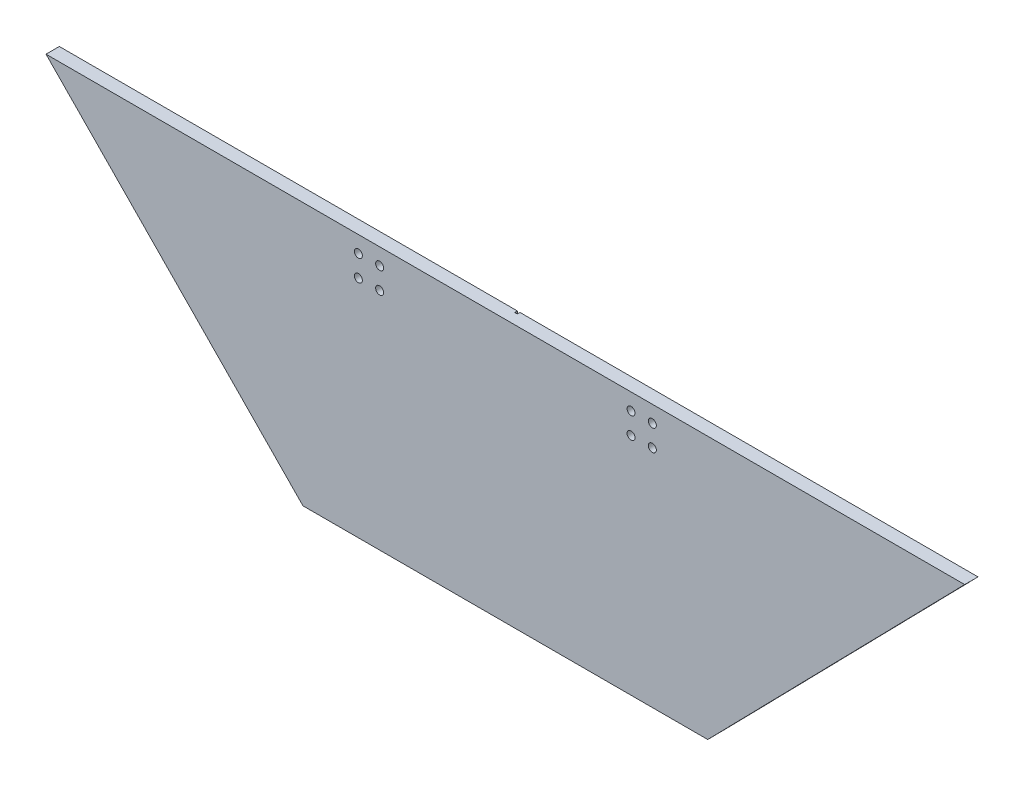
ISO-10303-21;
HEADER;
FILE_DESCRIPTION(('STEP AP214'),'2;1');
FILE_NAME('part.step','',(''),(''),'','','');
FILE_SCHEMA(('AUTOMOTIVE_DESIGN { 1 0 10303 214 1 1 1 1 }'));
ENDSEC;
DATA;
#1=APPLICATION_CONTEXT('core data for automotive mechanical design processes');
#2=APPLICATION_PROTOCOL_DEFINITION('international standard','automotive_design',2000,#1);
#3=PRODUCT_CONTEXT('',#1,'mechanical');
#4=PRODUCT('Part','Part','',(#3));
#5=PRODUCT_RELATED_PRODUCT_CATEGORY('part','',(#4));
#6=PRODUCT_DEFINITION_FORMATION('','',#4);
#7=PRODUCT_DEFINITION_CONTEXT('part definition',#1,'design');
#8=PRODUCT_DEFINITION('design','',#6,#7);
#9=PRODUCT_DEFINITION_SHAPE('','',#8);
#10=(LENGTH_UNIT() NAMED_UNIT(*) SI_UNIT(.MILLI.,.METRE.));
#11=(NAMED_UNIT(*) PLANE_ANGLE_UNIT() SI_UNIT($,.RADIAN.));
#12=(NAMED_UNIT(*) SI_UNIT($,.STERADIAN.) SOLID_ANGLE_UNIT());
#13=UNCERTAINTY_MEASURE_WITH_UNIT(LENGTH_MEASURE(1.E-05),#10,'distance_accuracy_value','');
#14=(GEOMETRIC_REPRESENTATION_CONTEXT(3) GLOBAL_UNCERTAINTY_ASSIGNED_CONTEXT((#13)) GLOBAL_UNIT_ASSIGNED_CONTEXT((#10,
#11,#12)) REPRESENTATION_CONTEXT('',''));
#15=CARTESIAN_POINT('',(0.,0.,0.));
#16=DIRECTION('',(0.,0.,1.));
#17=DIRECTION('',(1.,0.,0.));
#18=AXIS2_PLACEMENT_3D('',#15,#16,#17);
#19=CARTESIAN_POINT('',(0.,0.,0.));
#20=DIRECTION('',(0.,0.,-1.));
#21=DIRECTION('',(-1.,0.,0.));
#22=AXIS2_PLACEMENT_3D('',#19,#20,#21);
#23=PLANE('',#22);
#24=CARTESIAN_POINT('',(-55.1999999997619,-6.17470416727645,0.));
#25=DIRECTION('',(0.,0.,-1.));
#26=DIRECTION('',(-1.,0.,0.));
#27=AXIS2_PLACEMENT_3D('',#24,#25,#26);
#28=CIRCLE('',#27,1.5);
#29=CARTESIAN_POINT('',(-56.6999999997619,-6.17470416727645,0.));
#30=VERTEX_POINT('',#29);
#31=EDGE_CURVE('E239',#30,#30,#28,.T.);
#32=ORIENTED_EDGE('',*,*,#31,.F.);
#33=EDGE_LOOP('',(#32));
#34=FACE_BOUND('',#33,.T.);
#35=CARTESIAN_POINT('',(-47.1999999997619,-6.17470416727667,0.));
#36=DIRECTION('',(0.,0.,-1.));
#37=DIRECTION('',(-1.,0.,0.));
#38=AXIS2_PLACEMENT_3D('',#35,#36,#37);
#39=CIRCLE('',#38,1.5);
#40=CARTESIAN_POINT('',(-48.6999999997619,-6.17470416727667,0.));
#41=VERTEX_POINT('',#40);
#42=EDGE_CURVE('E235',#41,#41,#39,.T.);
#43=ORIENTED_EDGE('',*,*,#42,.F.);
#44=EDGE_LOOP('',(#43));
#45=FACE_BOUND('',#44,.T.);
#46=CARTESIAN_POINT('',(-47.1999999997621,-14.1747041672766,-1.11022302462516E-13));
#47=DIRECTION('',(0.,0.,-1.));
#48=DIRECTION('',(-1.,0.,0.));
#49=AXIS2_PLACEMENT_3D('',#46,#47,#48);
#50=CIRCLE('',#49,1.5);
#51=CARTESIAN_POINT('',(-48.6999999997621,-14.1747041672766,-1.11022302462516E-13));
#52=VERTEX_POINT('',#51);
#53=EDGE_CURVE('E234',#52,#52,#50,.T.);
#54=ORIENTED_EDGE('',*,*,#53,.F.);
#55=EDGE_LOOP('',(#54));
#56=FACE_BOUND('',#55,.T.);
#57=CARTESIAN_POINT('',(-55.1999999997621,-14.1747041672765,-1.66533453693773E-13));
#58=DIRECTION('',(0.,0.,-1.));
#59=DIRECTION('',(-1.,0.,0.));
#60=AXIS2_PLACEMENT_3D('',#57,#58,#59);
#61=CIRCLE('',#60,1.5);
#62=CARTESIAN_POINT('',(-56.6999999997621,-14.1747041672765,-1.66533453693773E-13));
#63=VERTEX_POINT('',#62);
#64=EDGE_CURVE('E230',#63,#63,#61,.T.);
#65=ORIENTED_EDGE('',*,*,#64,.F.);
#66=EDGE_LOOP('',(#65));
#67=FACE_BOUND('',#66,.T.);
#68=DIRECTION('',(0.,1.,0.));
#69=VECTOR('',#68,1.);
#70=CARTESIAN_POINT('',(-0.500000000000022,0.,0.));
#71=LINE('',#70,#69);
#72=CARTESIAN_POINT('',(-0.500000000000049,-89.9893785007516,0.));
#73=VERTEX_POINT('',#72);
#74=CARTESIAN_POINT('',(-0.500000000000022,1.11022302462516E-13,0.));
#75=VERTEX_POINT('',#74);
#76=EDGE_CURVE('E120',#73,#75,#71,.T.);
#77=ORIENTED_EDGE('',*,*,#76,.F.);
#78=DIRECTION('',(1.,0.,0.));
#79=VECTOR('',#78,1.);
#80=CARTESIAN_POINT('',(-76.,-89.9893785007516,-1.11022302462516E-13));
#81=LINE('',#80,#79);
#82=CARTESIAN_POINT('',(-84.4715420944423,-89.9893785007515,0.));
#83=VERTEX_POINT('',#82);
#84=EDGE_CURVE('E50',#73,#83,#81,.F.);
#85=ORIENTED_EDGE('',*,*,#84,.T.);
#86=DIRECTION('',(0.699275362318841,-0.714852409699971,0.));
#87=VECTOR('',#86,1.);
#88=CARTESIAN_POINT('',(-172.5,0.,0.));
#89=LINE('',#88,#87);
#90=CARTESIAN_POINT('',(-172.5,0.,0.));
#91=VERTEX_POINT('',#90);
#92=EDGE_CURVE('E141',#91,#83,#89,.T.);
#93=ORIENTED_EDGE('',*,*,#92,.F.);
#94=DIRECTION('',(-1.,0.,0.));
#95=VECTOR('',#94,1.);
#96=CARTESIAN_POINT('',(-172.5,0.,0.));
#97=LINE('',#96,#95);
#98=EDGE_CURVE('E165',#75,#91,#97,.T.);
#99=ORIENTED_EDGE('',*,*,#98,.F.);
#100=EDGE_LOOP('',(#77,#85,#93,#99));
#101=FACE_BOUND('',#100,.T.);
#102=ADVANCED_FACE('F40',(#34,#45,#56,#67,#101),#23,.T.);
#103=CARTESIAN_POINT('',(-172.5,0.,4.99999999999984));
#104=DIRECTION('',(0.71485240969997,0.699275362318841,0.));
#105=DIRECTION('',(-0.699275362318841,0.714852409699971,0.));
#106=AXIS2_PLACEMENT_3D('',#103,#104,#105);
#107=PLANE('',#106);
#108=ORIENTED_EDGE('',*,*,#92,.T.);
#109=CARTESIAN_POINT('',(-84.4715420944423,-89.9893785007515,9.99999999999987));
#110=DIRECTION('',(0.71485240969997,0.699275362318841,0.));
#111=DIRECTION('',(-0.699275362318841,0.714852409699971,0.));
#112=AXIS2_PLACEMENT_3D('',#109,#110,#111);
#113=ELLIPSE('',#112,13.9889015750777,10.);
#114=CARTESIAN_POINT('',(-76.,-98.6496325385959,4.99999999999995));
#115=VERTEX_POINT('',#114);
#116=EDGE_CURVE('E11',#83,#115,#113,.F.);
#117=ORIENTED_EDGE('',*,*,#116,.T.);
#118=DIRECTION('',(0.699275362318841,-0.714852409699971,0.));
#119=VECTOR('',#118,1.);
#120=CARTESIAN_POINT('',(-172.5,0.,4.99999999999984));
#121=LINE('',#120,#119);
#122=CARTESIAN_POINT('',(-172.5,0.,4.99999999999984));
#123=VERTEX_POINT('',#122);
#124=EDGE_CURVE('E145',#123,#115,#121,.T.);
#125=ORIENTED_EDGE('',*,*,#124,.F.);
#126=DIRECTION('',(0.,0.,-1.));
#127=VECTOR('',#126,1.);
#128=CARTESIAN_POINT('',(-172.5,0.,4.99999999999984));
#129=LINE('',#128,#127);
#130=EDGE_CURVE('E159',#123,#91,#129,.T.);
#131=ORIENTED_EDGE('',*,*,#130,.T.);
#132=EDGE_LOOP('',(#108,#117,#125,#131));
#133=FACE_BOUND('',#132,.T.);
#134=ADVANCED_FACE('F310',(#133),#107,.F.);
#135=CARTESIAN_POINT('',(172.5,0.,4.99999999999995));
#136=DIRECTION('',(-0.714852409699971,0.699275362318841,0.));
#137=DIRECTION('',(-0.69927536231884,-0.714852409699971,0.));
#138=AXIS2_PLACEMENT_3D('',#135,#136,#137);
#139=PLANE('',#138);
#140=DIRECTION('',(0.69927536231884,0.714852409699971,0.));
#141=VECTOR('',#140,1.);
#142=CARTESIAN_POINT('',(172.5,0.,4.99999999999995));
#143=LINE('',#142,#141);
#144=CARTESIAN_POINT('',(76.,-98.649632538596,4.99999999999995));
#145=VERTEX_POINT('',#144);
#146=CARTESIAN_POINT('',(172.5,0.,4.99999999999995));
#147=VERTEX_POINT('',#146);
#148=EDGE_CURVE('E153',#145,#147,#143,.T.);
#149=ORIENTED_EDGE('',*,*,#148,.F.);
#150=CARTESIAN_POINT('',(84.4715420944423,-89.9893785007515,9.99999999999987));
#151=DIRECTION('',(-0.714852409699971,0.699275362318841,0.));
#152=DIRECTION('',(-0.69927536231884,-0.714852409699971,0.));
#153=AXIS2_PLACEMENT_3D('',#150,#151,#152);
#154=ELLIPSE('',#153,13.9889015750777,10.);
#155=CARTESIAN_POINT('',(84.4715420944423,-89.9893785007516,-1.38777878078145E-13));
#156=VERTEX_POINT('',#155);
#157=EDGE_CURVE('E119',#145,#156,#154,.F.);
#158=ORIENTED_EDGE('',*,*,#157,.T.);
#159=DIRECTION('',(0.69927536231884,0.714852409699971,0.));
#160=VECTOR('',#159,1.);
#161=CARTESIAN_POINT('',(172.5,0.,0.));
#162=LINE('',#161,#160);
#163=CARTESIAN_POINT('',(172.5,0.,0.));
#164=VERTEX_POINT('',#163);
#165=EDGE_CURVE('E162',#156,#164,#162,.T.);
#166=ORIENTED_EDGE('',*,*,#165,.T.);
#167=DIRECTION('',(0.,0.,-1.));
#168=VECTOR('',#167,1.);
#169=CARTESIAN_POINT('',(172.5,0.,4.99999999999995));
#170=LINE('',#169,#168);
#171=EDGE_CURVE('E171',#147,#164,#170,.T.);
#172=ORIENTED_EDGE('',*,*,#171,.F.);
#173=EDGE_LOOP('',(#149,#158,#166,#172));
#174=FACE_BOUND('',#173,.T.);
#175=ADVANCED_FACE('F314',(#174),#139,.F.);
#176=CARTESIAN_POINT('',(-172.5,0.,4.99999999999984));
#177=DIRECTION('',(0.,-1.,0.));
#178=DIRECTION('',(1.,0.,0.));
#179=AXIS2_PLACEMENT_3D('',#176,#177,#178);
#180=PLANE('',#179);
#181=DIRECTION('',(1.,0.,0.));
#182=VECTOR('',#181,1.);
#183=CARTESIAN_POINT('',(-172.5,0.,0.999999999999834));
#184=LINE('',#183,#182);
#185=CARTESIAN_POINT('',(-0.500000000000022,0.,0.999999999999834));
#186=VERTEX_POINT('',#185);
#187=CARTESIAN_POINT('',(0.499999999999984,0.,0.999999999999834));
#188=VERTEX_POINT('',#187);
#189=EDGE_CURVE('E108',#186,#188,#184,.T.);
#190=ORIENTED_EDGE('',*,*,#189,.F.);
#191=DIRECTION('',(0.,0.,-1.));
#192=VECTOR('',#191,1.);
#193=CARTESIAN_POINT('',(-0.500000000000028,0.,4.99999999999984));
#194=LINE('',#193,#192);
#195=EDGE_CURVE('E137',#186,#75,#194,.T.);
#196=ORIENTED_EDGE('',*,*,#195,.T.);
#197=ORIENTED_EDGE('',*,*,#98,.T.);
#198=ORIENTED_EDGE('',*,*,#130,.F.);
#199=DIRECTION('',(-1.,0.,0.));
#200=VECTOR('',#199,1.);
#201=CARTESIAN_POINT('',(-172.5,0.,4.99999999999984));
#202=LINE('',#201,#200);
#203=EDGE_CURVE('E156',#147,#123,#202,.T.);
#204=ORIENTED_EDGE('',*,*,#203,.F.);
#205=ORIENTED_EDGE('',*,*,#171,.T.);
#206=CARTESIAN_POINT('',(0.499999999999973,1.66533453693773E-13,0.));
#207=VERTEX_POINT('',#206);
#208=EDGE_CURVE('E135',#164,#207,#97,.T.);
#209=ORIENTED_EDGE('',*,*,#208,.T.);
#210=DIRECTION('',(0.,0.,1.));
#211=VECTOR('',#210,1.);
#212=CARTESIAN_POINT('',(0.499999999999973,0.,4.99999999999984));
#213=LINE('',#212,#211);
#214=EDGE_CURVE('E125',#207,#188,#213,.T.);
#215=ORIENTED_EDGE('',*,*,#214,.T.);
#216=EDGE_LOOP('',(#190,#196,#197,#198,#204,#205,#209,#215));
#217=FACE_BOUND('',#216,.T.);
#218=ADVANCED_FACE('F132',(#217),#180,.F.);
#219=CARTESIAN_POINT('',(0.,0.,4.99999999999989));
#220=DIRECTION('',(0.,0.,-1.));
#221=DIRECTION('',(-1.,0.,0.));
#222=AXIS2_PLACEMENT_3D('',#219,#220,#221);
#223=PLANE('',#222);
#224=CARTESIAN_POINT('',(55.1999999997655,-6.17470416727778,4.99999999999992));
#225=DIRECTION('',(0.,0.,-1.));
#226=DIRECTION('',(-1.,0.,0.));
#227=AXIS2_PLACEMENT_3D('',#224,#225,#226);
#228=CIRCLE('',#227,1.5);
#229=CARTESIAN_POINT('',(53.6999999997655,-6.17470416727778,4.99999999999992));
#230=VERTEX_POINT('',#229);
#231=EDGE_CURVE('E198',#230,#230,#228,.T.);
#232=ORIENTED_EDGE('',*,*,#231,.T.);
#233=EDGE_LOOP('',(#232));
#234=FACE_BOUND('',#233,.T.);
#235=CARTESIAN_POINT('',(-55.1999999997619,-6.17470416727645,4.99999999999984));
#236=DIRECTION('',(0.,0.,-1.));
#237=DIRECTION('',(-1.,0.,0.));
#238=AXIS2_PLACEMENT_3D('',#235,#236,#237);
#239=CIRCLE('',#238,1.5);
#240=CARTESIAN_POINT('',(-56.6999999997619,-6.17470416727645,4.99999999999984));
#241=VERTEX_POINT('',#240);
#242=EDGE_CURVE('E44',#241,#241,#239,.T.);
#243=ORIENTED_EDGE('',*,*,#242,.T.);
#244=EDGE_LOOP('',(#243));
#245=FACE_BOUND('',#244,.T.);
#246=CARTESIAN_POINT('',(-47.1999999997619,-6.17470416727672,4.99999999999987));
#247=DIRECTION('',(0.,0.,-1.));
#248=DIRECTION('',(-1.,0.,0.));
#249=AXIS2_PLACEMENT_3D('',#246,#247,#248);
#250=CIRCLE('',#249,1.5);
#251=CARTESIAN_POINT('',(-48.6999999997619,-6.17470416727672,4.99999999999987));
#252=VERTEX_POINT('',#251);
#253=EDGE_CURVE('E201',#252,#252,#250,.T.);
#254=ORIENTED_EDGE('',*,*,#253,.T.);
#255=EDGE_LOOP('',(#254));
#256=FACE_BOUND('',#255,.T.);
#257=CARTESIAN_POINT('',(-47.1999999997621,-14.1747041672766,4.99999999999992));
#258=DIRECTION('',(0.,0.,-1.));
#259=DIRECTION('',(-1.,0.,0.));
#260=AXIS2_PLACEMENT_3D('',#257,#258,#259);
#261=CIRCLE('',#260,1.5);
#262=CARTESIAN_POINT('',(-48.6999999997621,-14.1747041672766,4.99999999999992));
#263=VERTEX_POINT('',#262);
#264=EDGE_CURVE('E197',#263,#263,#261,.T.);
#265=ORIENTED_EDGE('',*,*,#264,.T.);
#266=EDGE_LOOP('',(#265));
#267=FACE_BOUND('',#266,.T.);
#268=CARTESIAN_POINT('',(55.1999999997655,-14.1747041672778,4.99999999999995));
#269=DIRECTION('',(0.,0.,-1.));
#270=DIRECTION('',(-1.,0.,0.));
#271=AXIS2_PLACEMENT_3D('',#268,#269,#270);
#272=CIRCLE('',#271,1.5);
#273=CARTESIAN_POINT('',(53.6999999997655,-14.1747041672778,4.99999999999995));
#274=VERTEX_POINT('',#273);
#275=EDGE_CURVE('E218',#274,#274,#272,.T.);
#276=ORIENTED_EDGE('',*,*,#275,.T.);
#277=EDGE_LOOP('',(#276));
#278=FACE_BOUND('',#277,.T.);
#279=CARTESIAN_POINT('',(47.1999999997655,-14.1747041672778,4.99999999999989));
#280=DIRECTION('',(0.,0.,-1.));
#281=DIRECTION('',(-1.,0.,0.));
#282=AXIS2_PLACEMENT_3D('',#279,#280,#281);
#283=CIRCLE('',#282,1.5);
#284=CARTESIAN_POINT('',(45.6999999997655,-14.1747041672778,4.99999999999989));
#285=VERTEX_POINT('',#284);
#286=EDGE_CURVE('E222',#285,#285,#283,.T.);
#287=ORIENTED_EDGE('',*,*,#286,.T.);
#288=EDGE_LOOP('',(#287));
#289=FACE_BOUND('',#288,.T.);
#290=CARTESIAN_POINT('',(47.1999999997655,-6.17470416727778,4.99999999999995));
#291=DIRECTION('',(0.,0.,-1.));
#292=DIRECTION('',(-1.,0.,0.));
#293=AXIS2_PLACEMENT_3D('',#290,#291,#292);
#294=CIRCLE('',#293,1.5);
#295=CARTESIAN_POINT('',(45.6999999997655,-6.17470416727778,4.99999999999995));
#296=VERTEX_POINT('',#295);
#297=EDGE_CURVE('E226',#296,#296,#294,.T.);
#298=ORIENTED_EDGE('',*,*,#297,.T.);
#299=EDGE_LOOP('',(#298));
#300=FACE_BOUND('',#299,.T.);
#301=CARTESIAN_POINT('',(-55.1999999997621,-14.1747041672765,4.99999999999995));
#302=DIRECTION('',(0.,0.,-1.));
#303=DIRECTION('',(-1.,0.,0.));
#304=AXIS2_PLACEMENT_3D('',#301,#302,#303);
#305=CIRCLE('',#304,1.5);
#306=CARTESIAN_POINT('',(-56.6999999997621,-14.1747041672765,4.99999999999995));
#307=VERTEX_POINT('',#306);
#308=EDGE_CURVE('E193',#307,#307,#305,.T.);
#309=ORIENTED_EDGE('',*,*,#308,.T.);
#310=EDGE_LOOP('',(#309));
#311=FACE_BOUND('',#310,.T.);
#312=ORIENTED_EDGE('',*,*,#124,.T.);
#313=DIRECTION('',(1.,0.,0.));
#314=VECTOR('',#313,1.);
#315=CARTESIAN_POINT('',(76.,-98.649632538596,4.99999999999995));
#316=LINE('',#315,#314);
#317=EDGE_CURVE('E149',#115,#145,#316,.T.);
#318=ORIENTED_EDGE('',*,*,#317,.T.);
#319=ORIENTED_EDGE('',*,*,#148,.T.);
#320=ORIENTED_EDGE('',*,*,#203,.T.);
#321=EDGE_LOOP('',(#312,#318,#319,#320));
#322=FACE_BOUND('',#321,.T.);
#323=ADVANCED_FACE('F270',(#234,#245,#256,#267,#278,#289,#300,#311,#322),#223,.F.);
#324=CARTESIAN_POINT('',(55.1999999997655,-6.17470416727778,-1.38777878078145E-13));
#325=DIRECTION('',(0.,0.,-1.));
#326=DIRECTION('',(-1.,0.,0.));
#327=AXIS2_PLACEMENT_3D('',#324,#325,#326);
#328=CIRCLE('',#327,1.5);
#329=CARTESIAN_POINT('',(53.6999999997655,-6.17470416727778,-1.38777878078145E-13));
#330=VERTEX_POINT('',#329);
#331=EDGE_CURVE('E243',#330,#330,#328,.T.);
#332=ORIENTED_EDGE('',*,*,#331,.F.);
#333=EDGE_LOOP('',(#332));
#334=FACE_BOUND('',#333,.T.);
#335=CARTESIAN_POINT('',(55.1999999997655,-14.1747041672778,0.));
#336=DIRECTION('',(0.,0.,-1.));
#337=DIRECTION('',(-1.,0.,0.));
#338=AXIS2_PLACEMENT_3D('',#335,#336,#337);
#339=CIRCLE('',#338,1.5);
#340=CARTESIAN_POINT('',(53.6999999997655,-14.1747041672778,0.));
#341=VERTEX_POINT('',#340);
#342=EDGE_CURVE('E247',#341,#341,#339,.T.);
#343=ORIENTED_EDGE('',*,*,#342,.F.);
#344=EDGE_LOOP('',(#343));
#345=FACE_BOUND('',#344,.T.);
#346=CARTESIAN_POINT('',(47.1999999997655,-14.1747041672777,0.));
#347=DIRECTION('',(0.,0.,-1.));
#348=DIRECTION('',(-1.,0.,0.));
#349=AXIS2_PLACEMENT_3D('',#346,#347,#348);
#350=CIRCLE('',#349,1.5);
#351=CARTESIAN_POINT('',(45.6999999997655,-14.1747041672777,0.));
#352=VERTEX_POINT('',#351);
#353=EDGE_CURVE('E255',#352,#352,#350,.T.);
#354=ORIENTED_EDGE('',*,*,#353,.F.);
#355=EDGE_LOOP('',(#354));
#356=FACE_BOUND('',#355,.T.);
#357=CARTESIAN_POINT('',(47.1999999997655,-6.17470416727778,-1.11022302462516E-13));
#358=DIRECTION('',(0.,0.,-1.));
#359=DIRECTION('',(-1.,0.,0.));
#360=AXIS2_PLACEMENT_3D('',#357,#358,#359);
#361=CIRCLE('',#360,1.5);
#362=CARTESIAN_POINT('',(45.6999999997655,-6.17470416727778,-1.11022302462516E-13));
#363=VERTEX_POINT('',#362);
#364=EDGE_CURVE('E251',#363,#363,#361,.T.);
#365=ORIENTED_EDGE('',*,*,#364,.F.);
#366=EDGE_LOOP('',(#365));
#367=FACE_BOUND('',#366,.T.);
#368=ORIENTED_EDGE('',*,*,#165,.F.);
#369=DIRECTION('',(-1.,0.,0.));
#370=VECTOR('',#369,1.);
#371=CARTESIAN_POINT('',(42.4857710472212,-89.9893785007516,-1.94289029309402E-13));
#372=LINE('',#371,#370);
#373=CARTESIAN_POINT('',(0.499999999999945,-89.9893785007515,0.));
#374=VERTEX_POINT('',#373);
#375=EDGE_CURVE('E181',#156,#374,#372,.T.);
#376=ORIENTED_EDGE('',*,*,#375,.T.);
#377=DIRECTION('',(0.,-1.,0.));
#378=VECTOR('',#377,1.);
#379=CARTESIAN_POINT('',(0.499999999999984,0.,0.));
#380=LINE('',#379,#378);
#381=EDGE_CURVE('E174',#207,#374,#380,.T.);
#382=ORIENTED_EDGE('',*,*,#381,.F.);
#383=ORIENTED_EDGE('',*,*,#208,.F.);
#384=EDGE_LOOP('',(#368,#376,#382,#383));
#385=FACE_BOUND('',#384,.T.);
#386=ADVANCED_FACE('F267',(#334,#345,#356,#367,#385),#23,.T.);
#387=CARTESIAN_POINT('',(0.,0.,0.999999999999834));
#388=DIRECTION('',(0.,0.,-1.));
#389=DIRECTION('',(-1.,0.,0.));
#390=AXIS2_PLACEMENT_3D('',#387,#388,#389);
#391=PLANE('',#390);
#392=DIRECTION('',(0.,-1.,0.));
#393=VECTOR('',#392,1.);
#394=CARTESIAN_POINT('',(0.500000000000004,62.2351297653416,1.));
#395=LINE('',#394,#393);
#396=CARTESIAN_POINT('',(0.499999999999953,-94.3482774442922,0.999999999999973));
#397=VERTEX_POINT('',#396);
#398=EDGE_CURVE('E111',#188,#397,#395,.T.);
#399=ORIENTED_EDGE('',*,*,#398,.T.);
#400=DIRECTION('',(-1.,0.,0.));
#401=VECTOR('',#400,1.);
#402=CARTESIAN_POINT('',(0.499999999999953,-94.3482774442922,0.999999999999973));
#403=LINE('',#402,#401);
#404=CARTESIAN_POINT('',(-0.500000000000043,-94.3482774442922,1.00000000000006));
#405=VERTEX_POINT('',#404);
#406=EDGE_CURVE('E186',#397,#405,#403,.T.);
#407=ORIENTED_EDGE('',*,*,#406,.T.);
#408=DIRECTION('',(0.,1.,0.));
#409=VECTOR('',#408,1.);
#410=CARTESIAN_POINT('',(-0.500000000000004,62.2351297653416,1.));
#411=LINE('',#410,#409);
#412=EDGE_CURVE('E113',#405,#186,#411,.T.);
#413=ORIENTED_EDGE('',*,*,#412,.T.);
#414=ORIENTED_EDGE('',*,*,#189,.T.);
#415=EDGE_LOOP('',(#399,#407,#413,#414));
#416=FACE_BOUND('',#415,.T.);
#417=ADVANCED_FACE('F110',(#416),#391,.T.);
#418=CARTESIAN_POINT('',(-0.500000000000004,62.2351297653416,1.));
#419=DIRECTION('',(-1.,0.,0.));
#420=DIRECTION('',(0.,-1.,0.));
#421=AXIS2_PLACEMENT_3D('',#418,#419,#420);
#422=PLANE('',#421);
#423=ORIENTED_EDGE('',*,*,#412,.F.);
#424=CARTESIAN_POINT('',(-0.500000000000042,-89.9893785007516,9.99999999999993));
#425=DIRECTION('',(-1.,0.,0.));
#426=DIRECTION('',(0.,-1.,0.));
#427=AXIS2_PLACEMENT_3D('',#424,#425,#426);
#428=CIRCLE('',#427,10.);
#429=EDGE_CURVE('E65',#405,#73,#428,.F.);
#430=ORIENTED_EDGE('',*,*,#429,.T.);
#431=ORIENTED_EDGE('',*,*,#76,.T.);
#432=ORIENTED_EDGE('',*,*,#195,.F.);
#433=EDGE_LOOP('',(#423,#430,#431,#432));
#434=FACE_BOUND('',#433,.T.);
#435=ADVANCED_FACE('F284',(#434),#422,.F.);
#436=CARTESIAN_POINT('',(0.500000000000004,62.2351297653416,1.));
#437=DIRECTION('',(1.,0.,0.));
#438=DIRECTION('',(0.,1.,0.));
#439=AXIS2_PLACEMENT_3D('',#436,#437,#438);
#440=PLANE('',#439);
#441=ORIENTED_EDGE('',*,*,#381,.T.);
#442=CARTESIAN_POINT('',(0.499999999999945,-89.9893785007515,9.9999999999999));
#443=DIRECTION('',(1.,0.,0.));
#444=DIRECTION('',(0.,1.,0.));
#445=AXIS2_PLACEMENT_3D('',#442,#443,#444);
#446=CIRCLE('',#445,10.);
#447=EDGE_CURVE('E128',#374,#397,#446,.F.);
#448=ORIENTED_EDGE('',*,*,#447,.T.);
#449=ORIENTED_EDGE('',*,*,#398,.F.);
#450=ORIENTED_EDGE('',*,*,#214,.F.);
#451=EDGE_LOOP('',(#441,#448,#449,#450));
#452=FACE_BOUND('',#451,.T.);
#453=ADVANCED_FACE('F124',(#452),#440,.F.);
#454=CARTESIAN_POINT('',(76.,-89.9893785007515,9.99999999999993));
#455=DIRECTION('',(-1.,0.,0.));
#456=DIRECTION('',(0.,-1.,0.));
#457=AXIS2_PLACEMENT_3D('',#454,#455,#456);
#458=CYLINDRICAL_SURFACE('',#457,10.);
#459=ORIENTED_EDGE('',*,*,#116,.F.);
#460=ORIENTED_EDGE('',*,*,#84,.F.);
#461=ORIENTED_EDGE('',*,*,#429,.F.);
#462=ORIENTED_EDGE('',*,*,#406,.F.);
#463=ORIENTED_EDGE('',*,*,#447,.F.);
#464=ORIENTED_EDGE('',*,*,#375,.F.);
#465=ORIENTED_EDGE('',*,*,#157,.F.);
#466=ORIENTED_EDGE('',*,*,#317,.F.);
#467=EDGE_LOOP('',(#459,#460,#461,#462,#463,#464,#465,#466));
#468=FACE_BOUND('',#467,.T.);
#469=ADVANCED_FACE('F42',(#468),#458,.T.);
#470=CARTESIAN_POINT('',(47.1999999997655,-6.17470416727767,9.99999999999998));
#471=DIRECTION('',(0.,0.,-1.));
#472=DIRECTION('',(-1.,0.,0.));
#473=AXIS2_PLACEMENT_3D('',#470,#471,#472);
#474=CYLINDRICAL_SURFACE('',#473,1.5);
#475=ORIENTED_EDGE('',*,*,#364,.T.);
#476=EDGE_LOOP('',(#475));
#477=FACE_BOUND('',#476,.T.);
#478=ORIENTED_EDGE('',*,*,#297,.F.);
#479=EDGE_LOOP('',(#478));
#480=FACE_BOUND('',#479,.T.);
#481=ADVANCED_FACE('F359',(#477,#480),#474,.F.);
#482=CARTESIAN_POINT('',(47.1999999997655,-14.1747041672777,9.99999999999987));
#483=DIRECTION('',(0.,0.,-1.));
#484=DIRECTION('',(-1.,0.,0.));
#485=AXIS2_PLACEMENT_3D('',#482,#483,#484);
#486=CYLINDRICAL_SURFACE('',#485,1.5);
#487=ORIENTED_EDGE('',*,*,#353,.T.);
#488=EDGE_LOOP('',(#487));
#489=FACE_BOUND('',#488,.T.);
#490=ORIENTED_EDGE('',*,*,#286,.F.);
#491=EDGE_LOOP('',(#490));
#492=FACE_BOUND('',#491,.T.);
#493=ADVANCED_FACE('F362',(#489,#492),#486,.F.);
#494=CARTESIAN_POINT('',(55.1999999997655,-14.1747041672778,9.99999999999982));
#495=DIRECTION('',(0.,0.,-1.));
#496=DIRECTION('',(-1.,0.,0.));
#497=AXIS2_PLACEMENT_3D('',#494,#495,#496);
#498=CYLINDRICAL_SURFACE('',#497,1.5);
#499=ORIENTED_EDGE('',*,*,#342,.T.);
#500=EDGE_LOOP('',(#499));
#501=FACE_BOUND('',#500,.T.);
#502=ORIENTED_EDGE('',*,*,#275,.F.);
#503=EDGE_LOOP('',(#502));
#504=FACE_BOUND('',#503,.T.);
#505=ADVANCED_FACE('F264',(#501,#504),#498,.F.);
#506=CARTESIAN_POINT('',(55.1999999997655,-6.17470416727778,9.99999999999993));
#507=DIRECTION('',(0.,0.,-1.));
#508=DIRECTION('',(-1.,0.,0.));
#509=AXIS2_PLACEMENT_3D('',#506,#507,#508);
#510=CYLINDRICAL_SURFACE('',#509,1.5);
#511=ORIENTED_EDGE('',*,*,#331,.T.);
#512=EDGE_LOOP('',(#511));
#513=FACE_BOUND('',#512,.T.);
#514=ORIENTED_EDGE('',*,*,#231,.F.);
#515=EDGE_LOOP('',(#514));
#516=FACE_BOUND('',#515,.T.);
#517=ADVANCED_FACE('F343',(#513,#516),#510,.F.);
#518=CARTESIAN_POINT('',(-55.1999999997621,-14.1747041672765,9.99999999999995));
#519=DIRECTION('',(0.,0.,-1.));
#520=DIRECTION('',(-1.,0.,0.));
#521=AXIS2_PLACEMENT_3D('',#518,#519,#520);
#522=CYLINDRICAL_SURFACE('',#521,1.5);
#523=ORIENTED_EDGE('',*,*,#64,.T.);
#524=EDGE_LOOP('',(#523));
#525=FACE_BOUND('',#524,.T.);
#526=ORIENTED_EDGE('',*,*,#308,.F.);
#527=EDGE_LOOP('',(#526));
#528=FACE_BOUND('',#527,.T.);
#529=ADVANCED_FACE('F339',(#525,#528),#522,.F.);
#530=CARTESIAN_POINT('',(-47.1999999997621,-14.1747041672767,9.99999999999987));
#531=DIRECTION('',(0.,0.,-1.));
#532=DIRECTION('',(-1.,0.,0.));
#533=AXIS2_PLACEMENT_3D('',#530,#531,#532);
#534=CYLINDRICAL_SURFACE('',#533,1.5);
#535=ORIENTED_EDGE('',*,*,#53,.T.);
#536=EDGE_LOOP('',(#535));
#537=FACE_BOUND('',#536,.T.);
#538=ORIENTED_EDGE('',*,*,#264,.F.);
#539=EDGE_LOOP('',(#538));
#540=FACE_BOUND('',#539,.T.);
#541=ADVANCED_FACE('F342',(#537,#540),#534,.F.);
#542=CARTESIAN_POINT('',(-47.1999999997619,-6.17470416727667,9.99999999999984));
#543=DIRECTION('',(0.,0.,-1.));
#544=DIRECTION('',(-1.,0.,0.));
#545=AXIS2_PLACEMENT_3D('',#542,#543,#544);
#546=CYLINDRICAL_SURFACE('',#545,1.5);
#547=ORIENTED_EDGE('',*,*,#42,.T.);
#548=EDGE_LOOP('',(#547));
#549=FACE_BOUND('',#548,.T.);
#550=ORIENTED_EDGE('',*,*,#253,.F.);
#551=EDGE_LOOP('',(#550));
#552=FACE_BOUND('',#551,.T.);
#553=ADVANCED_FACE('F345',(#549,#552),#546,.F.);
#554=CARTESIAN_POINT('',(-55.1999999997619,-6.17470416727645,9.99999999999984));
#555=DIRECTION('',(0.,0.,-1.));
#556=DIRECTION('',(-1.,0.,0.));
#557=AXIS2_PLACEMENT_3D('',#554,#555,#556);
#558=CYLINDRICAL_SURFACE('',#557,1.5);
#559=ORIENTED_EDGE('',*,*,#31,.T.);
#560=EDGE_LOOP('',(#559));
#561=FACE_BOUND('',#560,.T.);
#562=ORIENTED_EDGE('',*,*,#242,.F.);
#563=EDGE_LOOP('',(#562));
#564=FACE_BOUND('',#563,.T.);
#565=ADVANCED_FACE('F348',(#561,#564),#558,.F.);
#566=CLOSED_SHELL('',(#102,#134,#175,#218,#323,#386,#417,#435,#453,#469,#481,#493,#505,#517,
#529,#541,#553,#565));
#567=MANIFOLD_SOLID_BREP('B2',#566);
#568=ADVANCED_BREP_SHAPE_REPRESENTATION('',(#18,#567),#14);
#569=SHAPE_DEFINITION_REPRESENTATION(#9,#568);
ENDSEC;
END-ISO-10303-21;
